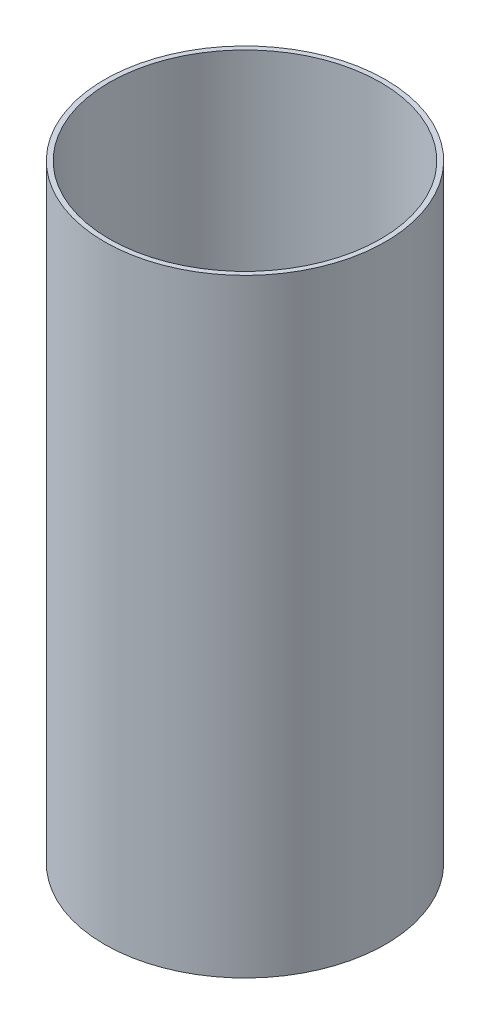
ISO-10303-21;
HEADER;
FILE_DESCRIPTION(('STEP AP214'),'2;1');
FILE_NAME('part.step','',(''),(''),'','','');
FILE_SCHEMA(('AUTOMOTIVE_DESIGN { 1 0 10303 214 1 1 1 1 }'));
ENDSEC;
DATA;
#1=APPLICATION_CONTEXT('core data for automotive mechanical design processes');
#2=APPLICATION_PROTOCOL_DEFINITION('international standard','automotive_design',2000,#1);
#3=PRODUCT_CONTEXT('',#1,'mechanical');
#4=PRODUCT('Part','Part','',(#3));
#5=PRODUCT_RELATED_PRODUCT_CATEGORY('part','',(#4));
#6=PRODUCT_DEFINITION_FORMATION('','',#4);
#7=PRODUCT_DEFINITION_CONTEXT('part definition',#1,'design');
#8=PRODUCT_DEFINITION('design','',#6,#7);
#9=PRODUCT_DEFINITION_SHAPE('','',#8);
#10=(LENGTH_UNIT() NAMED_UNIT(*) SI_UNIT(.MILLI.,.METRE.));
#11=(NAMED_UNIT(*) PLANE_ANGLE_UNIT() SI_UNIT($,.RADIAN.));
#12=(NAMED_UNIT(*) SI_UNIT($,.STERADIAN.) SOLID_ANGLE_UNIT());
#13=UNCERTAINTY_MEASURE_WITH_UNIT(LENGTH_MEASURE(1.E-05),#10,'distance_accuracy_value','');
#14=(GEOMETRIC_REPRESENTATION_CONTEXT(3) GLOBAL_UNCERTAINTY_ASSIGNED_CONTEXT((#13)) GLOBAL_UNIT_ASSIGNED_CONTEXT((#10,
#11,#12)) REPRESENTATION_CONTEXT('',''));
#15=CARTESIAN_POINT('',(0.,0.,0.));
#16=DIRECTION('',(0.,0.,1.));
#17=DIRECTION('',(1.,0.,0.));
#18=AXIS2_PLACEMENT_3D('',#15,#16,#17);
#19=CARTESIAN_POINT('',(0.,199.39,0.));
#20=DIRECTION('',(0.,1.,0.));
#21=DIRECTION('',(0.,0.,1.));
#22=AXIS2_PLACEMENT_3D('',#19,#20,#21);
#23=PLANE('',#22);
#24=CARTESIAN_POINT('',(0.,199.39,0.));
#25=DIRECTION('',(0.,1.,0.));
#26=DIRECTION('',(0.,0.,1.));
#27=AXIS2_PLACEMENT_3D('',#24,#25,#26);
#28=CIRCLE('',#27,92.075);
#29=CARTESIAN_POINT('',(0.,199.39,92.075));
#30=VERTEX_POINT('',#29);
#31=EDGE_CURVE('E10',#30,#30,#28,.T.);
#32=ORIENTED_EDGE('',*,*,#31,.T.);
#33=EDGE_LOOP('',(#32));
#34=FACE_BOUND('',#33,.T.);
#35=CARTESIAN_POINT('',(0.,199.39,0.));
#36=DIRECTION('',(0.,1.,0.));
#37=DIRECTION('',(0.,0.,1.));
#38=AXIS2_PLACEMENT_3D('',#35,#36,#37);
#39=CIRCLE('',#38,88.9);
#40=CARTESIAN_POINT('',(0.,199.39,88.9));
#41=VERTEX_POINT('',#40);
#42=EDGE_CURVE('E52',#41,#41,#39,.T.);
#43=ORIENTED_EDGE('',*,*,#42,.F.);
#44=EDGE_LOOP('',(#43));
#45=FACE_BOUND('',#44,.T.);
#46=ADVANCED_FACE('F41',(#34,#45),#23,.T.);
#47=CARTESIAN_POINT('',(0.,-199.39,0.));
#48=DIRECTION('',(0.,1.,0.));
#49=DIRECTION('',(0.,0.,1.));
#50=AXIS2_PLACEMENT_3D('',#47,#48,#49);
#51=PLANE('',#50);
#52=CARTESIAN_POINT('',(0.,-199.39,0.));
#53=DIRECTION('',(0.,1.,0.));
#54=DIRECTION('',(0.,0.,1.));
#55=AXIS2_PLACEMENT_3D('',#52,#53,#54);
#56=CIRCLE('',#55,92.075);
#57=CARTESIAN_POINT('',(0.,-199.39,92.075));
#58=VERTEX_POINT('',#57);
#59=EDGE_CURVE('E45',#58,#58,#56,.T.);
#60=ORIENTED_EDGE('',*,*,#59,.F.);
#61=EDGE_LOOP('',(#60));
#62=FACE_BOUND('',#61,.T.);
#63=CARTESIAN_POINT('',(0.,-199.39,0.));
#64=DIRECTION('',(0.,1.,0.));
#65=DIRECTION('',(0.,0.,1.));
#66=AXIS2_PLACEMENT_3D('',#63,#64,#65);
#67=CIRCLE('',#66,88.9);
#68=CARTESIAN_POINT('',(0.,-199.39,88.9));
#69=VERTEX_POINT('',#68);
#70=EDGE_CURVE('E54',#69,#69,#67,.T.);
#71=ORIENTED_EDGE('',*,*,#70,.T.);
#72=EDGE_LOOP('',(#71));
#73=FACE_BOUND('',#72,.T.);
#74=ADVANCED_FACE('F64',(#62,#73),#51,.F.);
#75=CARTESIAN_POINT('',(0.,199.39,0.));
#76=DIRECTION('',(0.,-1.,0.));
#77=DIRECTION('',(0.,0.,-1.));
#78=AXIS2_PLACEMENT_3D('',#75,#76,#77);
#79=CYLINDRICAL_SURFACE('',#78,92.075);
#80=ORIENTED_EDGE('',*,*,#31,.F.);
#81=EDGE_LOOP('',(#80));
#82=FACE_BOUND('',#81,.T.);
#83=ORIENTED_EDGE('',*,*,#59,.T.);
#84=EDGE_LOOP('',(#83));
#85=FACE_BOUND('',#84,.T.);
#86=ADVANCED_FACE('F43',(#82,#85),#79,.T.);
#87=CARTESIAN_POINT('',(0.,199.39,0.));
#88=DIRECTION('',(0.,-1.,0.));
#89=DIRECTION('',(0.,0.,-1.));
#90=AXIS2_PLACEMENT_3D('',#87,#88,#89);
#91=CYLINDRICAL_SURFACE('',#90,88.9);
#92=ORIENTED_EDGE('',*,*,#42,.T.);
#93=EDGE_LOOP('',(#92));
#94=FACE_BOUND('',#93,.T.);
#95=ORIENTED_EDGE('',*,*,#70,.F.);
#96=EDGE_LOOP('',(#95));
#97=FACE_BOUND('',#96,.T.);
#98=ADVANCED_FACE('F60',(#94,#97),#91,.F.);
#99=CLOSED_SHELL('',(#46,#74,#86,#98));
#100=MANIFOLD_SOLID_BREP('B2',#99);
#101=ADVANCED_BREP_SHAPE_REPRESENTATION('',(#18,#100),#14);
#102=SHAPE_DEFINITION_REPRESENTATION(#9,#101);
ENDSEC;
END-ISO-10303-21;
